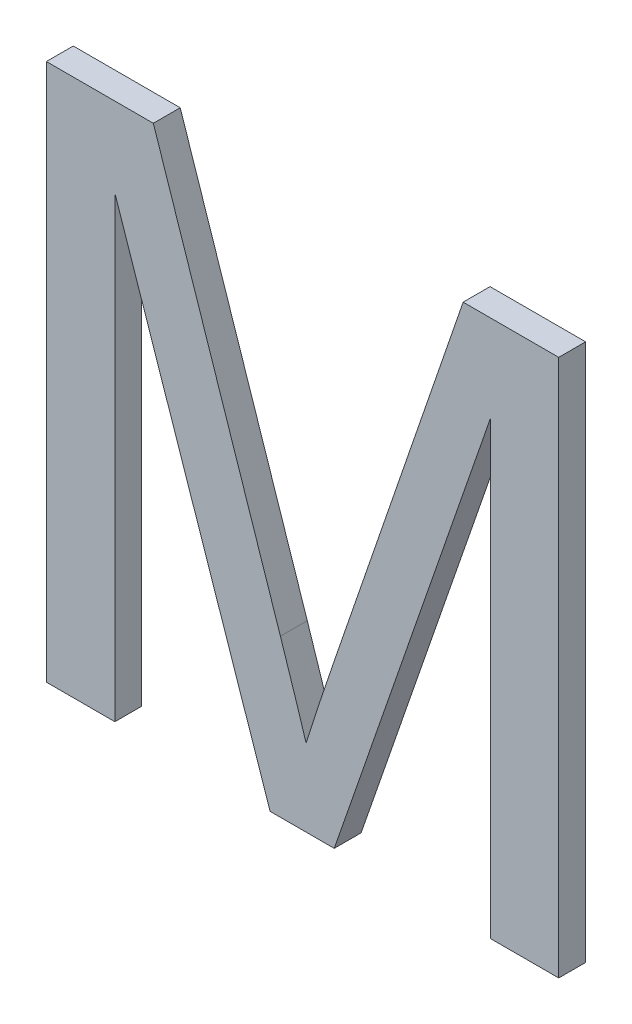
ISO-10303-21;
HEADER;
FILE_DESCRIPTION(('STEP AP214'),'2;1');
FILE_NAME('part.step','',(''),(''),'','','');
FILE_SCHEMA(('AUTOMOTIVE_DESIGN { 1 0 10303 214 1 1 1 1 }'));
ENDSEC;
DATA;
#1=APPLICATION_CONTEXT('core data for automotive mechanical design processes');
#2=APPLICATION_PROTOCOL_DEFINITION('international standard','automotive_design',2000,#1);
#3=PRODUCT_CONTEXT('',#1,'mechanical');
#4=PRODUCT('Part','Part','',(#3));
#5=PRODUCT_RELATED_PRODUCT_CATEGORY('part','',(#4));
#6=PRODUCT_DEFINITION_FORMATION('','',#4);
#7=PRODUCT_DEFINITION_CONTEXT('part definition',#1,'design');
#8=PRODUCT_DEFINITION('design','',#6,#7);
#9=PRODUCT_DEFINITION_SHAPE('','',#8);
#10=(LENGTH_UNIT() NAMED_UNIT(*) SI_UNIT(.MILLI.,.METRE.));
#11=(NAMED_UNIT(*) PLANE_ANGLE_UNIT() SI_UNIT($,.RADIAN.));
#12=(NAMED_UNIT(*) SI_UNIT($,.STERADIAN.) SOLID_ANGLE_UNIT());
#13=UNCERTAINTY_MEASURE_WITH_UNIT(LENGTH_MEASURE(1.E-05),#10,'distance_accuracy_value','');
#14=(GEOMETRIC_REPRESENTATION_CONTEXT(3) GLOBAL_UNCERTAINTY_ASSIGNED_CONTEXT((#13)) GLOBAL_UNIT_ASSIGNED_CONTEXT((#10,
#11,#12)) REPRESENTATION_CONTEXT('',''));
#15=CARTESIAN_POINT('',(0.,0.,0.));
#16=DIRECTION('',(0.,0.,1.));
#17=DIRECTION('',(1.,0.,0.));
#18=AXIS2_PLACEMENT_3D('',#15,#16,#17);
#19=CARTESIAN_POINT('',(8.219926375209,0.482738550611,0.05));
#20=DIRECTION('',(0.,0.,1.));
#21=DIRECTION('',(1.,0.,0.));
#22=AXIS2_PLACEMENT_3D('',#19,#20,#21);
#23=PLANE('',#22);
#24=DIRECTION('',(0.,1.,0.));
#25=VECTOR('',#24,1.);
#26=CARTESIAN_POINT('',(7.743186773256,0.,0.05));
#27=LINE('',#26,#25);
#28=CARTESIAN_POINT('',(7.743186773256,0.,0.05));
#29=VERTEX_POINT('',#28);
#30=CARTESIAN_POINT('',(7.743186773256,1.,0.05));
#31=VERTEX_POINT('',#30);
#32=EDGE_CURVE('E156',#29,#31,#27,.T.);
#33=ORIENTED_EDGE('',*,*,#32,.F.);
#34=DIRECTION('',(-1.,0.,0.));
#35=VECTOR('',#34,1.);
#36=CARTESIAN_POINT('',(7.870594113372,0.,0.05));
#37=LINE('',#36,#35);
#38=CARTESIAN_POINT('',(7.870594113372,0.,0.05));
#39=VERTEX_POINT('',#38);
#40=EDGE_CURVE('E205',#39,#29,#37,.T.);
#41=ORIENTED_EDGE('',*,*,#40,.F.);
#42=DIRECTION('',(0.,-1.,0.));
#43=VECTOR('',#42,1.);
#44=CARTESIAN_POINT('',(7.870594113372,0.851471656977,0.05));
#45=LINE('',#44,#43);
#46=CARTESIAN_POINT('',(7.870594113372,0.851471656977,0.05));
#47=VERTEX_POINT('',#46);
#48=EDGE_CURVE('E214',#47,#39,#45,.T.);
#49=ORIENTED_EDGE('',*,*,#48,.F.);
#50=DIRECTION('',(-0.321285019320027,0.94698254279608,0.));
#51=VECTOR('',#50,1.);
#52=CARTESIAN_POINT('',(8.159474927326,0.,0.05));
#53=LINE('',#52,#51);
#54=CARTESIAN_POINT('',(8.159474927326,0.,0.05));
#55=VERTEX_POINT('',#54);
#56=EDGE_CURVE('E253',#55,#47,#53,.T.);
#57=ORIENTED_EDGE('',*,*,#56,.F.);
#58=DIRECTION('',(-1.,0.,0.));
#59=VECTOR('',#58,1.);
#60=CARTESIAN_POINT('',(8.278706395349,0.,0.05));
#61=LINE('',#60,#59);
#62=CARTESIAN_POINT('',(8.278706395349,0.,0.05));
#63=VERTEX_POINT('',#62);
#64=EDGE_CURVE('E245',#63,#55,#61,.T.);
#65=ORIENTED_EDGE('',*,*,#64,.F.);
#66=DIRECTION('',(-0.327570063092006,-0.944826890899015,0.));
#67=VECTOR('',#66,1.);
#68=CARTESIAN_POINT('',(8.568949854651,0.837163880814,0.05));
#69=LINE('',#68,#67);
#70=CARTESIAN_POINT('',(8.568949854651,0.837163880814,0.05));
#71=VERTEX_POINT('',#70);
#72=EDGE_CURVE('E189',#71,#63,#69,.T.);
#73=ORIENTED_EDGE('',*,*,#72,.F.);
#74=DIRECTION('',(0.,1.,0.));
#75=VECTOR('',#74,1.);
#76=CARTESIAN_POINT('',(8.568949854651,0.,0.05));
#77=LINE('',#76,#75);
#78=CARTESIAN_POINT('',(8.568949854651,0.,0.05));
#79=VERTEX_POINT('',#78);
#80=EDGE_CURVE('E223',#79,#71,#77,.T.);
#81=ORIENTED_EDGE('',*,*,#80,.F.);
#82=DIRECTION('',(-1.,0.,0.));
#83=VECTOR('',#82,1.);
#84=CARTESIAN_POINT('',(8.696357194767,0.,0.05));
#85=LINE('',#84,#83);
#86=CARTESIAN_POINT('',(8.696357194767,0.,0.05));
#87=VERTEX_POINT('',#86);
#88=EDGE_CURVE('E225',#87,#79,#85,.T.);
#89=ORIENTED_EDGE('',*,*,#88,.F.);
#90=DIRECTION('',(0.,-1.,0.));
#91=VECTOR('',#90,1.);
#92=CARTESIAN_POINT('',(8.696357194767,1.,0.05));
#93=LINE('',#92,#91);
#94=CARTESIAN_POINT('',(8.696357194767,1.,0.05));
#95=VERTEX_POINT('',#94);
#96=EDGE_CURVE('E206',#95,#87,#93,.T.);
#97=ORIENTED_EDGE('',*,*,#96,.F.);
#98=DIRECTION('',(1.,0.,0.));
#99=VECTOR('',#98,1.);
#100=CARTESIAN_POINT('',(8.518531976744,1.,0.05));
#101=LINE('',#100,#99);
#102=CARTESIAN_POINT('',(8.518531976744,1.,0.05));
#103=VERTEX_POINT('',#102);
#104=EDGE_CURVE('E238',#103,#95,#101,.T.);
#105=ORIENTED_EDGE('',*,*,#104,.F.);
#106=DIRECTION('',(0.324991786147987,0.945716838665962,0.));
#107=VECTOR('',#106,1.);
#108=CARTESIAN_POINT('',(8.279387718023,0.304097020349,0.05));
#109=LINE('',#108,#107);
#110=CARTESIAN_POINT('',(8.279387718023,0.304097020349,0.05));
#111=VERTEX_POINT('',#110);
#112=EDGE_CURVE('E272',#111,#103,#109,.T.);
#113=ORIENTED_EDGE('',*,*,#112,.F.);
#114=CARTESIAN_POINT('',(8.226244549419,0.143759084302,0.05));
#115=CARTESIAN_POINT('',(8.243277616279,0.198355741279,0.05));
#116=CARTESIAN_POINT('',(8.279387718023,0.304097020349,0.05));
#117=(BOUNDED_CURVE() B_SPLINE_CURVE(2,(#114,#115,#116),.UNSPECIFIED.,.F.,
.F.) B_SPLINE_CURVE_WITH_KNOTS((3,3),(0.,1.),
.UNSPECIFIED.) CURVE() GEOMETRIC_REPRESENTATION_ITEM() RATIONAL_B_SPLINE_CURVE((1.,1.,1.)) REPRESENTATION_ITEM(''));
#118=CARTESIAN_POINT('',(8.226244549419,0.143759084302,0.05));
#119=VERTEX_POINT('',#118);
#120=EDGE_CURVE('E289',#119,#111,#117,.T.);
#121=ORIENTED_EDGE('',*,*,#120,.F.);
#122=CARTESIAN_POINT('',(8.178551962209,0.291787790698,0.05));
#123=CARTESIAN_POINT('',(8.211255450581,0.192859738372,0.05));
#124=CARTESIAN_POINT('',(8.226244549419,0.143759084302,0.05));
#125=(BOUNDED_CURVE() B_SPLINE_CURVE(2,(#122,#123,#124),.UNSPECIFIED.,.F.,
.F.) B_SPLINE_CURVE_WITH_KNOTS((3,3),(0.,1.),
.UNSPECIFIED.) CURVE() GEOMETRIC_REPRESENTATION_ITEM() RATIONAL_B_SPLINE_CURVE((1.,1.,1.)) REPRESENTATION_ITEM(''));
#126=CARTESIAN_POINT('',(8.178551962209,0.291787790698,0.05));
#127=VERTEX_POINT('',#126);
#128=EDGE_CURVE('E197',#127,#119,#125,.T.);
#129=ORIENTED_EDGE('',*,*,#128,.F.);
#130=DIRECTION('',(0.316647498315843,-0.948543284099528,0.));
#131=VECTOR('',#130,1.);
#132=CARTESIAN_POINT('',(7.942132994186,1.,0.05));
#133=LINE('',#132,#131);
#134=CARTESIAN_POINT('',(7.942132994186,1.,0.05));
#135=VERTEX_POINT('',#134);
#136=EDGE_CURVE('E21',#135,#127,#133,.T.);
#137=ORIENTED_EDGE('',*,*,#136,.F.);
#138=DIRECTION('',(1.,0.,0.));
#139=VECTOR('',#138,1.);
#140=CARTESIAN_POINT('',(7.743186773256,1.,0.05));
#141=LINE('',#140,#139);
#142=EDGE_CURVE('E28',#31,#135,#141,.T.);
#143=ORIENTED_EDGE('',*,*,#142,.F.);
#144=EDGE_LOOP('',(#33,#41,#49,#57,#65,#73,#81,#89,#97,#105,#113,#121,#129,#137,#143));
#145=FACE_BOUND('',#144,.T.);
#146=ADVANCED_FACE('F17',(#145),#23,.T.);
#147=CARTESIAN_POINT('',(8.219926375209,0.482738550611,0.));
#148=DIRECTION('',(0.,0.,1.));
#149=DIRECTION('',(1.,0.,0.));
#150=AXIS2_PLACEMENT_3D('',#147,#148,#149);
#151=PLANE('',#150);
#152=DIRECTION('',(1.,0.,0.));
#153=VECTOR('',#152,1.);
#154=CARTESIAN_POINT('',(7.743186773256,1.,0.));
#155=LINE('',#154,#153);
#156=CARTESIAN_POINT('',(7.743186773256,1.,0.));
#157=VERTEX_POINT('',#156);
#158=CARTESIAN_POINT('',(7.942132994186,1.,0.));
#159=VERTEX_POINT('',#158);
#160=EDGE_CURVE('E11',#157,#159,#155,.T.);
#161=ORIENTED_EDGE('',*,*,#160,.T.);
#162=DIRECTION('',(0.316647498315843,-0.948543284099528,0.));
#163=VECTOR('',#162,1.);
#164=CARTESIAN_POINT('',(7.942132994186,1.,0.));
#165=LINE('',#164,#163);
#166=CARTESIAN_POINT('',(8.178551962209,0.291787790698,0.));
#167=VERTEX_POINT('',#166);
#168=EDGE_CURVE('E161',#159,#167,#165,.T.);
#169=ORIENTED_EDGE('',*,*,#168,.T.);
#170=CARTESIAN_POINT('',(8.178551962209,0.291787790698,0.));
#171=CARTESIAN_POINT('',(8.211255450581,0.192859738372,0.));
#172=CARTESIAN_POINT('',(8.226244549419,0.143759084302,0.));
#173=(BOUNDED_CURVE() B_SPLINE_CURVE(2,(#170,#171,#172),.UNSPECIFIED.,.F.,
.F.) B_SPLINE_CURVE_WITH_KNOTS((3,3),(0.,1.),
.UNSPECIFIED.) CURVE() GEOMETRIC_REPRESENTATION_ITEM() RATIONAL_B_SPLINE_CURVE((1.,1.,1.)) REPRESENTATION_ITEM(''));
#174=CARTESIAN_POINT('',(8.226244549419,0.143759084302,0.));
#175=VERTEX_POINT('',#174);
#176=EDGE_CURVE('E191',#167,#175,#173,.T.);
#177=ORIENTED_EDGE('',*,*,#176,.T.);
#178=CARTESIAN_POINT('',(8.226244549419,0.143759084302,0.));
#179=CARTESIAN_POINT('',(8.243277616279,0.198355741279,0.));
#180=CARTESIAN_POINT('',(8.279387718023,0.304097020349,0.));
#181=(BOUNDED_CURVE() B_SPLINE_CURVE(2,(#178,#179,#180),.UNSPECIFIED.,.F.,
.F.) B_SPLINE_CURVE_WITH_KNOTS((3,3),(0.,1.),
.UNSPECIFIED.) CURVE() GEOMETRIC_REPRESENTATION_ITEM() RATIONAL_B_SPLINE_CURVE((1.,1.,1.)) REPRESENTATION_ITEM(''));
#182=CARTESIAN_POINT('',(8.279387718023,0.304097020349,0.));
#183=VERTEX_POINT('',#182);
#184=EDGE_CURVE('E284',#175,#183,#181,.T.);
#185=ORIENTED_EDGE('',*,*,#184,.T.);
#186=DIRECTION('',(0.324991786147987,0.945716838665962,0.));
#187=VECTOR('',#186,1.);
#188=CARTESIAN_POINT('',(8.279387718023,0.304097020349,0.));
#189=LINE('',#188,#187);
#190=CARTESIAN_POINT('',(8.518531976744,1.,0.));
#191=VERTEX_POINT('',#190);
#192=EDGE_CURVE('E184',#183,#191,#189,.T.);
#193=ORIENTED_EDGE('',*,*,#192,.T.);
#194=DIRECTION('',(1.,0.,0.));
#195=VECTOR('',#194,1.);
#196=CARTESIAN_POINT('',(8.518531976744,1.,0.));
#197=LINE('',#196,#195);
#198=CARTESIAN_POINT('',(8.696357194767,1.,0.));
#199=VERTEX_POINT('',#198);
#200=EDGE_CURVE('E233',#191,#199,#197,.T.);
#201=ORIENTED_EDGE('',*,*,#200,.T.);
#202=DIRECTION('',(0.,-1.,0.));
#203=VECTOR('',#202,1.);
#204=CARTESIAN_POINT('',(8.696357194767,1.,0.));
#205=LINE('',#204,#203);
#206=CARTESIAN_POINT('',(8.696357194767,0.,0.));
#207=VERTEX_POINT('',#206);
#208=EDGE_CURVE('E209',#199,#207,#205,.T.);
#209=ORIENTED_EDGE('',*,*,#208,.T.);
#210=DIRECTION('',(-1.,0.,0.));
#211=VECTOR('',#210,1.);
#212=CARTESIAN_POINT('',(8.696357194767,0.,0.));
#213=LINE('',#212,#211);
#214=CARTESIAN_POINT('',(8.568949854651,0.,0.));
#215=VERTEX_POINT('',#214);
#216=EDGE_CURVE('E227',#207,#215,#213,.T.);
#217=ORIENTED_EDGE('',*,*,#216,.T.);
#218=DIRECTION('',(0.,1.,0.));
#219=VECTOR('',#218,1.);
#220=CARTESIAN_POINT('',(8.568949854651,0.,0.));
#221=LINE('',#220,#219);
#222=CARTESIAN_POINT('',(8.568949854651,0.837163880814,0.));
#223=VERTEX_POINT('',#222);
#224=EDGE_CURVE('E230',#215,#223,#221,.T.);
#225=ORIENTED_EDGE('',*,*,#224,.T.);
#226=DIRECTION('',(-0.327570063092006,-0.944826890899015,0.));
#227=VECTOR('',#226,1.);
#228=CARTESIAN_POINT('',(8.568949854651,0.837163880814,0.));
#229=LINE('',#228,#227);
#230=CARTESIAN_POINT('',(8.278706395349,0.,0.));
#231=VERTEX_POINT('',#230);
#232=EDGE_CURVE('E224',#223,#231,#229,.T.);
#233=ORIENTED_EDGE('',*,*,#232,.T.);
#234=DIRECTION('',(-1.,0.,0.));
#235=VECTOR('',#234,1.);
#236=CARTESIAN_POINT('',(8.278706395349,0.,0.));
#237=LINE('',#236,#235);
#238=CARTESIAN_POINT('',(8.159474927326,0.,0.));
#239=VERTEX_POINT('',#238);
#240=EDGE_CURVE('E190',#231,#239,#237,.T.);
#241=ORIENTED_EDGE('',*,*,#240,.T.);
#242=DIRECTION('',(-0.321285019320027,0.94698254279608,0.));
#243=VECTOR('',#242,1.);
#244=CARTESIAN_POINT('',(8.159474927326,0.,0.));
#245=LINE('',#244,#243);
#246=CARTESIAN_POINT('',(7.870594113372,0.851471656977,0.));
#247=VERTEX_POINT('',#246);
#248=EDGE_CURVE('E246',#239,#247,#245,.T.);
#249=ORIENTED_EDGE('',*,*,#248,.T.);
#250=DIRECTION('',(0.,-1.,0.));
#251=VECTOR('',#250,1.);
#252=CARTESIAN_POINT('',(7.870594113372,0.851471656977,0.));
#253=LINE('',#252,#251);
#254=CARTESIAN_POINT('',(7.870594113372,0.,0.));
#255=VERTEX_POINT('',#254);
#256=EDGE_CURVE('E217',#247,#255,#253,.T.);
#257=ORIENTED_EDGE('',*,*,#256,.T.);
#258=DIRECTION('',(-1.,0.,0.));
#259=VECTOR('',#258,1.);
#260=CARTESIAN_POINT('',(7.870594113372,0.,0.));
#261=LINE('',#260,#259);
#262=CARTESIAN_POINT('',(7.743186773256,0.,0.));
#263=VERTEX_POINT('',#262);
#264=EDGE_CURVE('E213',#255,#263,#261,.T.);
#265=ORIENTED_EDGE('',*,*,#264,.T.);
#266=DIRECTION('',(0.,1.,0.));
#267=VECTOR('',#266,1.);
#268=CARTESIAN_POINT('',(7.743186773256,0.,0.));
#269=LINE('',#268,#267);
#270=EDGE_CURVE('E170',#263,#157,#269,.T.);
#271=ORIENTED_EDGE('',*,*,#270,.T.);
#272=EDGE_LOOP('',(#161,#169,#177,#185,#193,#201,#209,#217,#225,#233,#241,#249,#257,#265,#271));
#273=FACE_BOUND('',#272,.T.);
#274=ADVANCED_FACE('F324',(#273),#151,.F.);
#275=CARTESIAN_POINT('',(7.743186773256,1.,0.));
#276=DIRECTION('',(0.,1.,0.));
#277=DIRECTION('',(1.,0.,0.));
#278=AXIS2_PLACEMENT_3D('',#275,#276,#277);
#279=PLANE('',#278);
#280=DIRECTION('',(0.,0.,1.));
#281=VECTOR('',#280,1.);
#282=CARTESIAN_POINT('',(7.743186773256,1.,0.));
#283=LINE('',#282,#281);
#284=EDGE_CURVE('E164',#157,#31,#283,.T.);
#285=ORIENTED_EDGE('',*,*,#284,.T.);
#286=ORIENTED_EDGE('',*,*,#142,.T.);
#287=DIRECTION('',(0.,0.,1.));
#288=VECTOR('',#287,1.);
#289=CARTESIAN_POINT('',(7.942132994186,1.,0.));
#290=LINE('',#289,#288);
#291=EDGE_CURVE('E196',#159,#135,#290,.T.);
#292=ORIENTED_EDGE('',*,*,#291,.F.);
#293=ORIENTED_EDGE('',*,*,#160,.F.);
#294=EDGE_LOOP('',(#285,#286,#292,#293));
#295=FACE_BOUND('',#294,.T.);
#296=ADVANCED_FACE('F165',(#295),#279,.T.);
#297=CARTESIAN_POINT('',(7.942132994186,1.,0.));
#298=DIRECTION('',(0.948543284099528,0.316647498315843,0.));
#299=DIRECTION('',(0.,0.,-1.));
#300=AXIS2_PLACEMENT_3D('',#297,#298,#299);
#301=PLANE('',#300);
#302=ORIENTED_EDGE('',*,*,#291,.T.);
#303=ORIENTED_EDGE('',*,*,#136,.T.);
#304=DIRECTION('',(0.,0.,1.));
#305=VECTOR('',#304,1.);
#306=CARTESIAN_POINT('',(8.178551962209,0.291787790698,0.));
#307=LINE('',#306,#305);
#308=EDGE_CURVE('E263',#167,#127,#307,.T.);
#309=ORIENTED_EDGE('',*,*,#308,.F.);
#310=ORIENTED_EDGE('',*,*,#168,.F.);
#311=EDGE_LOOP('',(#302,#303,#309,#310));
#312=FACE_BOUND('',#311,.T.);
#313=ADVANCED_FACE('F394',(#312),#301,.T.);
#314=CARTESIAN_POINT('',(8.178551962209,0.291787790698,0.));
#315=CARTESIAN_POINT('',(8.211255450581,0.192859738372,0.));
#316=CARTESIAN_POINT('',(8.226244549419,0.143759084302,0.));
#317=(BOUNDED_CURVE() B_SPLINE_CURVE(2,(#314,#315,#316),.UNSPECIFIED.,.F.,
.F.) B_SPLINE_CURVE_WITH_KNOTS((3,3),(0.,1.),
.UNSPECIFIED.) CURVE() GEOMETRIC_REPRESENTATION_ITEM() RATIONAL_B_SPLINE_CURVE((1.,1.,1.)) REPRESENTATION_ITEM(''));
#318=DIRECTION('',(0.,0.,-1.));
#319=VECTOR('',#318,1.);
#320=SURFACE_OF_LINEAR_EXTRUSION('',#317,#319);
#321=ORIENTED_EDGE('',*,*,#308,.T.);
#322=ORIENTED_EDGE('',*,*,#128,.T.);
#323=DIRECTION('',(0.,0.,1.));
#324=VECTOR('',#323,1.);
#325=CARTESIAN_POINT('',(8.226244549419,0.143759084302,0.));
#326=LINE('',#325,#324);
#327=EDGE_CURVE('E302',#175,#119,#326,.T.);
#328=ORIENTED_EDGE('',*,*,#327,.F.);
#329=ORIENTED_EDGE('',*,*,#176,.F.);
#330=EDGE_LOOP('',(#321,#322,#328,#329));
#331=FACE_BOUND('',#330,.T.);
#332=ADVANCED_FACE('F396',(#331),#320,.T.);
#333=CARTESIAN_POINT('',(8.226244549419,0.143759084302,0.));
#334=CARTESIAN_POINT('',(8.243277616279,0.198355741279,0.));
#335=CARTESIAN_POINT('',(8.279387718023,0.304097020349,0.));
#336=(BOUNDED_CURVE() B_SPLINE_CURVE(2,(#333,#334,#335),.UNSPECIFIED.,.F.,
.F.) B_SPLINE_CURVE_WITH_KNOTS((3,3),(0.,1.),
.UNSPECIFIED.) CURVE() GEOMETRIC_REPRESENTATION_ITEM() RATIONAL_B_SPLINE_CURVE((1.,1.,1.)) REPRESENTATION_ITEM(''));
#337=DIRECTION('',(0.,0.,-1.));
#338=VECTOR('',#337,1.);
#339=SURFACE_OF_LINEAR_EXTRUSION('',#336,#338);
#340=ORIENTED_EDGE('',*,*,#327,.T.);
#341=ORIENTED_EDGE('',*,*,#120,.T.);
#342=DIRECTION('',(0.,0.,1.));
#343=VECTOR('',#342,1.);
#344=CARTESIAN_POINT('',(8.279387718023,0.304097020349,0.));
#345=LINE('',#344,#343);
#346=EDGE_CURVE('E237',#183,#111,#345,.T.);
#347=ORIENTED_EDGE('',*,*,#346,.F.);
#348=ORIENTED_EDGE('',*,*,#184,.F.);
#349=EDGE_LOOP('',(#340,#341,#347,#348));
#350=FACE_BOUND('',#349,.T.);
#351=ADVANCED_FACE('F397',(#350),#339,.T.);
#352=CARTESIAN_POINT('',(8.279387718023,0.304097020349,0.));
#353=DIRECTION('',(-0.945716838665962,0.324991786147987,0.));
#354=DIRECTION('',(0.,0.,1.));
#355=AXIS2_PLACEMENT_3D('',#352,#353,#354);
#356=PLANE('',#355);
#357=ORIENTED_EDGE('',*,*,#346,.T.);
#358=ORIENTED_EDGE('',*,*,#112,.T.);
#359=DIRECTION('',(0.,0.,1.));
#360=VECTOR('',#359,1.);
#361=CARTESIAN_POINT('',(8.518531976744,1.,0.));
#362=LINE('',#361,#360);
#363=EDGE_CURVE('E256',#191,#103,#362,.T.);
#364=ORIENTED_EDGE('',*,*,#363,.F.);
#365=ORIENTED_EDGE('',*,*,#192,.F.);
#366=EDGE_LOOP('',(#357,#358,#364,#365));
#367=FACE_BOUND('',#366,.T.);
#368=ADVANCED_FACE('F333',(#367),#356,.T.);
#369=CARTESIAN_POINT('',(8.518531976744,1.,0.));
#370=DIRECTION('',(0.,1.,0.));
#371=DIRECTION('',(1.,0.,0.));
#372=AXIS2_PLACEMENT_3D('',#369,#370,#371);
#373=PLANE('',#372);
#374=ORIENTED_EDGE('',*,*,#363,.T.);
#375=ORIENTED_EDGE('',*,*,#104,.T.);
#376=DIRECTION('',(0.,0.,1.));
#377=VECTOR('',#376,1.);
#378=CARTESIAN_POINT('',(8.696357194767,1.,0.));
#379=LINE('',#378,#377);
#380=EDGE_CURVE('E210',#199,#95,#379,.T.);
#381=ORIENTED_EDGE('',*,*,#380,.F.);
#382=ORIENTED_EDGE('',*,*,#200,.F.);
#383=EDGE_LOOP('',(#374,#375,#381,#382));
#384=FACE_BOUND('',#383,.T.);
#385=ADVANCED_FACE('F331',(#384),#373,.T.);
#386=CARTESIAN_POINT('',(8.696357194767,1.,0.));
#387=DIRECTION('',(1.,0.,0.));
#388=DIRECTION('',(0.,1.,0.));
#389=AXIS2_PLACEMENT_3D('',#386,#387,#388);
#390=PLANE('',#389);
#391=ORIENTED_EDGE('',*,*,#380,.T.);
#392=ORIENTED_EDGE('',*,*,#96,.T.);
#393=DIRECTION('',(0.,0.,1.));
#394=VECTOR('',#393,1.);
#395=CARTESIAN_POINT('',(8.696357194767,0.,0.));
#396=LINE('',#395,#394);
#397=EDGE_CURVE('E228',#207,#87,#396,.T.);
#398=ORIENTED_EDGE('',*,*,#397,.F.);
#399=ORIENTED_EDGE('',*,*,#208,.F.);
#400=EDGE_LOOP('',(#391,#392,#398,#399));
#401=FACE_BOUND('',#400,.T.);
#402=ADVANCED_FACE('F19',(#401),#390,.T.);
#403=CARTESIAN_POINT('',(8.696357194767,0.,0.));
#404=DIRECTION('',(0.,-1.,0.));
#405=DIRECTION('',(0.,0.,-1.));
#406=AXIS2_PLACEMENT_3D('',#403,#404,#405);
#407=PLANE('',#406);
#408=ORIENTED_EDGE('',*,*,#397,.T.);
#409=ORIENTED_EDGE('',*,*,#88,.T.);
#410=DIRECTION('',(0.,0.,1.));
#411=VECTOR('',#410,1.);
#412=CARTESIAN_POINT('',(8.568949854651,0.,0.));
#413=LINE('',#412,#411);
#414=EDGE_CURVE('E219',#215,#79,#413,.T.);
#415=ORIENTED_EDGE('',*,*,#414,.F.);
#416=ORIENTED_EDGE('',*,*,#216,.F.);
#417=EDGE_LOOP('',(#408,#409,#415,#416));
#418=FACE_BOUND('',#417,.T.);
#419=ADVANCED_FACE('F358',(#418),#407,.T.);
#420=CARTESIAN_POINT('',(8.568949854651,0.,0.));
#421=DIRECTION('',(-1.,0.,0.));
#422=DIRECTION('',(0.,0.,1.));
#423=AXIS2_PLACEMENT_3D('',#420,#421,#422);
#424=PLANE('',#423);
#425=ORIENTED_EDGE('',*,*,#414,.T.);
#426=ORIENTED_EDGE('',*,*,#80,.T.);
#427=DIRECTION('',(0.,0.,1.));
#428=VECTOR('',#427,1.);
#429=CARTESIAN_POINT('',(8.568949854651,0.837163880814,0.));
#430=LINE('',#429,#428);
#431=EDGE_CURVE('E186',#223,#71,#430,.T.);
#432=ORIENTED_EDGE('',*,*,#431,.F.);
#433=ORIENTED_EDGE('',*,*,#224,.F.);
#434=EDGE_LOOP('',(#425,#426,#432,#433));
#435=FACE_BOUND('',#434,.T.);
#436=ADVANCED_FACE('F364',(#435),#424,.T.);
#437=CARTESIAN_POINT('',(8.568949854651,0.837163880814,0.));
#438=DIRECTION('',(0.944826890899015,-0.327570063092006,0.));
#439=DIRECTION('',(0.,0.,-1.));
#440=AXIS2_PLACEMENT_3D('',#437,#438,#439);
#441=PLANE('',#440);
#442=ORIENTED_EDGE('',*,*,#431,.T.);
#443=ORIENTED_EDGE('',*,*,#72,.T.);
#444=DIRECTION('',(0.,0.,1.));
#445=VECTOR('',#444,1.);
#446=CARTESIAN_POINT('',(8.278706395349,0.,0.));
#447=LINE('',#446,#445);
#448=EDGE_CURVE('E241',#231,#63,#447,.T.);
#449=ORIENTED_EDGE('',*,*,#448,.F.);
#450=ORIENTED_EDGE('',*,*,#232,.F.);
#451=EDGE_LOOP('',(#442,#443,#449,#450));
#452=FACE_BOUND('',#451,.T.);
#453=ADVANCED_FACE('F367',(#452),#441,.T.);
#454=CARTESIAN_POINT('',(8.278706395349,0.,0.));
#455=DIRECTION('',(0.,-1.,0.));
#456=DIRECTION('',(0.,0.,-1.));
#457=AXIS2_PLACEMENT_3D('',#454,#455,#456);
#458=PLANE('',#457);
#459=ORIENTED_EDGE('',*,*,#448,.T.);
#460=ORIENTED_EDGE('',*,*,#64,.T.);
#461=DIRECTION('',(0.,0.,1.));
#462=VECTOR('',#461,1.);
#463=CARTESIAN_POINT('',(8.159474927326,0.,0.));
#464=LINE('',#463,#462);
#465=EDGE_CURVE('E249',#239,#55,#464,.T.);
#466=ORIENTED_EDGE('',*,*,#465,.F.);
#467=ORIENTED_EDGE('',*,*,#240,.F.);
#468=EDGE_LOOP('',(#459,#460,#466,#467));
#469=FACE_BOUND('',#468,.T.);
#470=ADVANCED_FACE('F374',(#469),#458,.T.);
#471=CARTESIAN_POINT('',(8.159474927326,0.,0.));
#472=DIRECTION('',(-0.94698254279608,-0.321285019320027,0.));
#473=DIRECTION('',(-0.321285019320027,0.94698254279608,0.));
#474=AXIS2_PLACEMENT_3D('',#471,#472,#473);
#475=PLANE('',#474);
#476=ORIENTED_EDGE('',*,*,#465,.T.);
#477=ORIENTED_EDGE('',*,*,#56,.T.);
#478=DIRECTION('',(0.,0.,1.));
#479=VECTOR('',#478,1.);
#480=CARTESIAN_POINT('',(7.870594113372,0.851471656977,0.));
#481=LINE('',#480,#479);
#482=EDGE_CURVE('E218',#247,#47,#481,.T.);
#483=ORIENTED_EDGE('',*,*,#482,.F.);
#484=ORIENTED_EDGE('',*,*,#248,.F.);
#485=EDGE_LOOP('',(#476,#477,#483,#484));
#486=FACE_BOUND('',#485,.T.);
#487=ADVANCED_FACE('F377',(#486),#475,.T.);
#488=CARTESIAN_POINT('',(7.870594113372,0.851471656977,0.));
#489=DIRECTION('',(1.,0.,0.));
#490=DIRECTION('',(0.,1.,0.));
#491=AXIS2_PLACEMENT_3D('',#488,#489,#490);
#492=PLANE('',#491);
#493=ORIENTED_EDGE('',*,*,#482,.T.);
#494=ORIENTED_EDGE('',*,*,#48,.T.);
#495=DIRECTION('',(0.,0.,1.));
#496=VECTOR('',#495,1.);
#497=CARTESIAN_POINT('',(7.870594113372,0.,0.));
#498=LINE('',#497,#496);
#499=EDGE_CURVE('E198',#255,#39,#498,.T.);
#500=ORIENTED_EDGE('',*,*,#499,.F.);
#501=ORIENTED_EDGE('',*,*,#256,.F.);
#502=EDGE_LOOP('',(#493,#494,#500,#501));
#503=FACE_BOUND('',#502,.T.);
#504=ADVANCED_FACE('F384',(#503),#492,.T.);
#505=CARTESIAN_POINT('',(7.870594113372,0.,0.));
#506=DIRECTION('',(0.,-1.,0.));
#507=DIRECTION('',(0.,0.,-1.));
#508=AXIS2_PLACEMENT_3D('',#505,#506,#507);
#509=PLANE('',#508);
#510=ORIENTED_EDGE('',*,*,#499,.T.);
#511=ORIENTED_EDGE('',*,*,#40,.T.);
#512=DIRECTION('',(0.,0.,1.));
#513=VECTOR('',#512,1.);
#514=CARTESIAN_POINT('',(7.743186773256,0.,0.));
#515=LINE('',#514,#513);
#516=EDGE_CURVE('E174',#263,#29,#515,.T.);
#517=ORIENTED_EDGE('',*,*,#516,.F.);
#518=ORIENTED_EDGE('',*,*,#264,.F.);
#519=EDGE_LOOP('',(#510,#511,#517,#518));
#520=FACE_BOUND('',#519,.T.);
#521=ADVANCED_FACE('F386',(#520),#509,.T.);
#522=CARTESIAN_POINT('',(7.743186773256,0.,0.));
#523=DIRECTION('',(-1.,0.,0.));
#524=DIRECTION('',(0.,0.,1.));
#525=AXIS2_PLACEMENT_3D('',#522,#523,#524);
#526=PLANE('',#525);
#527=ORIENTED_EDGE('',*,*,#516,.T.);
#528=ORIENTED_EDGE('',*,*,#32,.T.);
#529=ORIENTED_EDGE('',*,*,#284,.F.);
#530=ORIENTED_EDGE('',*,*,#270,.F.);
#531=EDGE_LOOP('',(#527,#528,#529,#530));
#532=FACE_BOUND('',#531,.T.);
#533=ADVANCED_FACE('F172',(#532),#526,.T.);
#534=CLOSED_SHELL('',(#146,#274,#296,#313,#332,#351,#368,#385,#402,#419,#436,#453,#470,#487,
#504,#521,#533));
#535=MANIFOLD_SOLID_BREP('B1',#534);
#536=ADVANCED_BREP_SHAPE_REPRESENTATION('',(#18,#535),#14);
#537=SHAPE_DEFINITION_REPRESENTATION(#9,#536);
ENDSEC;
END-ISO-10303-21;
